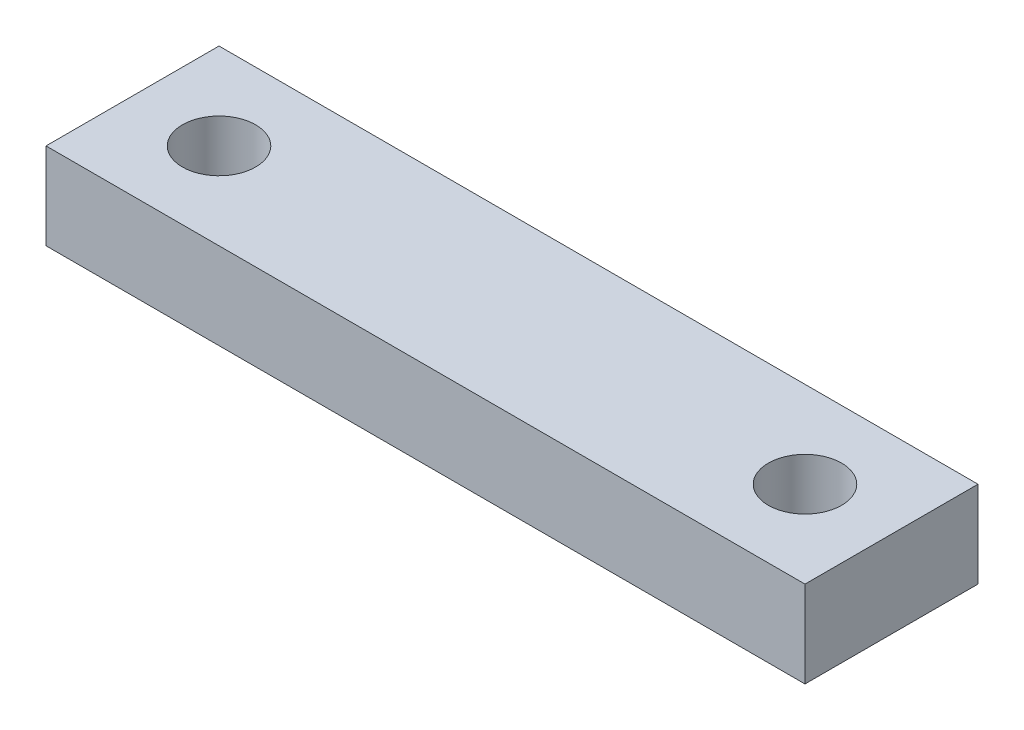
ISO-10303-21;
HEADER;
FILE_DESCRIPTION(('STEP AP214'),'2;1');
FILE_NAME('part.step','',(''),(''),'','','');
FILE_SCHEMA(('AUTOMOTIVE_DESIGN { 1 0 10303 214 1 1 1 1 }'));
ENDSEC;
DATA;
#1=APPLICATION_CONTEXT('core data for automotive mechanical design processes');
#2=APPLICATION_PROTOCOL_DEFINITION('international standard','automotive_design',2000,#1);
#3=PRODUCT_CONTEXT('',#1,'mechanical');
#4=PRODUCT('Part','Part','',(#3));
#5=PRODUCT_RELATED_PRODUCT_CATEGORY('part','',(#4));
#6=PRODUCT_DEFINITION_FORMATION('','',#4);
#7=PRODUCT_DEFINITION_CONTEXT('part definition',#1,'design');
#8=PRODUCT_DEFINITION('design','',#6,#7);
#9=PRODUCT_DEFINITION_SHAPE('','',#8);
#10=(LENGTH_UNIT() NAMED_UNIT(*) SI_UNIT(.MILLI.,.METRE.));
#11=(NAMED_UNIT(*) PLANE_ANGLE_UNIT() SI_UNIT($,.RADIAN.));
#12=(NAMED_UNIT(*) SI_UNIT($,.STERADIAN.) SOLID_ANGLE_UNIT());
#13=UNCERTAINTY_MEASURE_WITH_UNIT(LENGTH_MEASURE(1.E-05),#10,'distance_accuracy_value','');
#14=(GEOMETRIC_REPRESENTATION_CONTEXT(3) GLOBAL_UNCERTAINTY_ASSIGNED_CONTEXT((#13)) GLOBAL_UNIT_ASSIGNED_CONTEXT((#10,
#11,#12)) REPRESENTATION_CONTEXT('',''));
#15=CARTESIAN_POINT('',(0.,0.,0.));
#16=DIRECTION('',(0.,0.,1.));
#17=DIRECTION('',(1.,0.,0.));
#18=AXIS2_PLACEMENT_3D('',#15,#16,#17);
#19=CARTESIAN_POINT('',(-215.213432633717,20.1411509817197,60.));
#20=DIRECTION('',(1.,0.,0.));
#21=DIRECTION('',(0.,0.,-1.));
#22=AXIS2_PLACEMENT_3D('',#19,#20,#21);
#23=PLANE('',#22);
#24=DIRECTION('',(0.,-1.,0.));
#25=VECTOR('',#24,1.);
#26=CARTESIAN_POINT('',(-215.213432633717,20.1411509817197,0.));
#27=LINE('',#26,#25);
#28=CARTESIAN_POINT('',(-215.213432633717,20.1411509817197,0.));
#29=VERTEX_POINT('',#28);
#30=CARTESIAN_POINT('',(-215.213432633717,-9.8588490182803,0.));
#31=VERTEX_POINT('',#30);
#32=EDGE_CURVE('E113',#29,#31,#27,.T.);
#33=ORIENTED_EDGE('',*,*,#32,.T.);
#34=DIRECTION('',(0.,0.,-1.));
#35=VECTOR('',#34,1.);
#36=CARTESIAN_POINT('',(-215.213432633717,-9.8588490182803,60.));
#37=LINE('',#36,#35);
#38=CARTESIAN_POINT('',(-215.213432633717,-9.8588490182803,60.));
#39=VERTEX_POINT('',#38);
#40=EDGE_CURVE('E11',#39,#31,#37,.T.);
#41=ORIENTED_EDGE('',*,*,#40,.F.);
#42=DIRECTION('',(0.,-1.,0.));
#43=VECTOR('',#42,1.);
#44=CARTESIAN_POINT('',(-215.213432633717,20.1411509817197,60.));
#45=LINE('',#44,#43);
#46=CARTESIAN_POINT('',(-215.213432633717,20.1411509817197,60.));
#47=VERTEX_POINT('',#46);
#48=EDGE_CURVE('E97',#47,#39,#45,.T.);
#49=ORIENTED_EDGE('',*,*,#48,.F.);
#50=DIRECTION('',(0.,0.,-1.));
#51=VECTOR('',#50,1.);
#52=CARTESIAN_POINT('',(-215.213432633717,20.1411509817197,60.));
#53=LINE('',#52,#51);
#54=EDGE_CURVE('E112',#47,#29,#53,.T.);
#55=ORIENTED_EDGE('',*,*,#54,.T.);
#56=EDGE_LOOP('',(#33,#41,#49,#55));
#57=FACE_BOUND('',#56,.T.);
#58=ADVANCED_FACE('F50',(#57),#23,.F.);
#59=CARTESIAN_POINT('',(-215.213432633717,-9.8588490182803,60.));
#60=DIRECTION('',(0.,1.,0.));
#61=DIRECTION('',(0.,0.,1.));
#62=AXIS2_PLACEMENT_3D('',#59,#60,#61);
#63=PLANE('',#62);
#64=CARTESIAN_POINT('',(17.986567366283,-9.8588490182803,30.));
#65=DIRECTION('',(0.,1.,0.));
#66=DIRECTION('',(0.,0.,1.));
#67=AXIS2_PLACEMENT_3D('',#64,#65,#66);
#68=CIRCLE('',#67,12.7);
#69=CARTESIAN_POINT('',(17.986567366283,-9.8588490182803,42.7));
#70=VERTEX_POINT('',#69);
#71=EDGE_CURVE('E118',#70,#70,#68,.T.);
#72=ORIENTED_EDGE('',*,*,#71,.T.);
#73=EDGE_LOOP('',(#72));
#74=FACE_BOUND('',#73,.T.);
#75=CARTESIAN_POINT('',(-185.213432633717,-9.8588490182803,30.));
#76=DIRECTION('',(0.,1.,0.));
#77=DIRECTION('',(0.,0.,1.));
#78=AXIS2_PLACEMENT_3D('',#75,#76,#77);
#79=CIRCLE('',#78,12.7);
#80=CARTESIAN_POINT('',(-185.213432633717,-9.8588490182803,42.7));
#81=VERTEX_POINT('',#80);
#82=EDGE_CURVE('E138',#81,#81,#79,.T.);
#83=ORIENTED_EDGE('',*,*,#82,.T.);
#84=EDGE_LOOP('',(#83));
#85=FACE_BOUND('',#84,.T.);
#86=DIRECTION('',(1.,0.,0.));
#87=VECTOR('',#86,1.);
#88=CARTESIAN_POINT('',(-215.213432633717,-9.8588490182803,0.));
#89=LINE('',#88,#87);
#90=CARTESIAN_POINT('',(47.986567366283,-9.8588490182803,0.));
#91=VERTEX_POINT('',#90);
#92=EDGE_CURVE('E102',#31,#91,#89,.T.);
#93=ORIENTED_EDGE('',*,*,#92,.T.);
#94=DIRECTION('',(0.,0.,-1.));
#95=VECTOR('',#94,1.);
#96=CARTESIAN_POINT('',(47.986567366283,-9.8588490182803,60.));
#97=LINE('',#96,#95);
#98=CARTESIAN_POINT('',(47.986567366283,-9.8588490182803,60.));
#99=VERTEX_POINT('',#98);
#100=EDGE_CURVE('E57',#99,#91,#97,.T.);
#101=ORIENTED_EDGE('',*,*,#100,.F.);
#102=DIRECTION('',(1.,0.,0.));
#103=VECTOR('',#102,1.);
#104=CARTESIAN_POINT('',(-215.213432633717,-9.8588490182803,60.));
#105=LINE('',#104,#103);
#106=EDGE_CURVE('E94',#39,#99,#105,.T.);
#107=ORIENTED_EDGE('',*,*,#106,.F.);
#108=ORIENTED_EDGE('',*,*,#40,.T.);
#109=EDGE_LOOP('',(#93,#101,#107,#108));
#110=FACE_BOUND('',#109,.T.);
#111=ADVANCED_FACE('F103',(#74,#85,#110),#63,.F.);
#112=CARTESIAN_POINT('',(47.986567366283,20.1411509817197,60.));
#113=DIRECTION('',(-1.,0.,0.));
#114=DIRECTION('',(0.,-1.,0.));
#115=AXIS2_PLACEMENT_3D('',#112,#113,#114);
#116=PLANE('',#115);
#117=DIRECTION('',(0.,1.,0.));
#118=VECTOR('',#117,1.);
#119=CARTESIAN_POINT('',(47.986567366283,20.1411509817197,0.));
#120=LINE('',#119,#118);
#121=CARTESIAN_POINT('',(47.986567366283,20.1411509817197,0.));
#122=VERTEX_POINT('',#121);
#123=EDGE_CURVE('E83',#91,#122,#120,.T.);
#124=ORIENTED_EDGE('',*,*,#123,.T.);
#125=DIRECTION('',(0.,0.,-1.));
#126=VECTOR('',#125,1.);
#127=CARTESIAN_POINT('',(47.986567366283,20.1411509817197,60.));
#128=LINE('',#127,#126);
#129=CARTESIAN_POINT('',(47.986567366283,20.1411509817197,60.));
#130=VERTEX_POINT('',#129);
#131=EDGE_CURVE('E106',#130,#122,#128,.T.);
#132=ORIENTED_EDGE('',*,*,#131,.F.);
#133=DIRECTION('',(0.,1.,0.));
#134=VECTOR('',#133,1.);
#135=CARTESIAN_POINT('',(47.986567366283,20.1411509817197,60.));
#136=LINE('',#135,#134);
#137=EDGE_CURVE('E100',#99,#130,#136,.T.);
#138=ORIENTED_EDGE('',*,*,#137,.F.);
#139=ORIENTED_EDGE('',*,*,#100,.T.);
#140=EDGE_LOOP('',(#124,#132,#138,#139));
#141=FACE_BOUND('',#140,.T.);
#142=ADVANCED_FACE('F110',(#141),#116,.F.);
#143=CARTESIAN_POINT('',(-215.213432633717,20.1411509817197,60.));
#144=DIRECTION('',(0.,-1.,0.));
#145=DIRECTION('',(0.,0.,-1.));
#146=AXIS2_PLACEMENT_3D('',#143,#144,#145);
#147=PLANE('',#146);
#148=CARTESIAN_POINT('',(17.986567366283,20.1411509817197,30.));
#149=DIRECTION('',(0.,1.,0.));
#150=DIRECTION('',(0.,0.,1.));
#151=AXIS2_PLACEMENT_3D('',#148,#149,#150);
#152=CIRCLE('',#151,12.7);
#153=CARTESIAN_POINT('',(17.986567366283,20.1411509817197,42.7));
#154=VERTEX_POINT('',#153);
#155=EDGE_CURVE('E145',#154,#154,#152,.T.);
#156=ORIENTED_EDGE('',*,*,#155,.F.);
#157=EDGE_LOOP('',(#156));
#158=FACE_BOUND('',#157,.T.);
#159=CARTESIAN_POINT('',(-185.213432633717,20.1411509817197,30.));
#160=DIRECTION('',(0.,1.,0.));
#161=DIRECTION('',(0.,0.,1.));
#162=AXIS2_PLACEMENT_3D('',#159,#160,#161);
#163=CIRCLE('',#162,12.7);
#164=CARTESIAN_POINT('',(-185.213432633717,20.1411509817197,42.7));
#165=VERTEX_POINT('',#164);
#166=EDGE_CURVE('E137',#165,#165,#163,.T.);
#167=ORIENTED_EDGE('',*,*,#166,.F.);
#168=EDGE_LOOP('',(#167));
#169=FACE_BOUND('',#168,.T.);
#170=DIRECTION('',(-1.,0.,0.));
#171=VECTOR('',#170,1.);
#172=CARTESIAN_POINT('',(-215.213432633717,20.1411509817197,0.));
#173=LINE('',#172,#171);
#174=EDGE_CURVE('E87',#122,#29,#173,.T.);
#175=ORIENTED_EDGE('',*,*,#174,.T.);
#176=ORIENTED_EDGE('',*,*,#54,.F.);
#177=DIRECTION('',(-1.,0.,0.));
#178=VECTOR('',#177,1.);
#179=CARTESIAN_POINT('',(-215.213432633717,20.1411509817197,60.));
#180=LINE('',#179,#178);
#181=EDGE_CURVE('E63',#130,#47,#180,.T.);
#182=ORIENTED_EDGE('',*,*,#181,.F.);
#183=ORIENTED_EDGE('',*,*,#131,.T.);
#184=EDGE_LOOP('',(#175,#176,#182,#183));
#185=FACE_BOUND('',#184,.T.);
#186=ADVANCED_FACE('F129',(#158,#169,#185),#147,.F.);
#187=CARTESIAN_POINT('',(0.,0.,60.));
#188=DIRECTION('',(0.,0.,1.));
#189=DIRECTION('',(1.,0.,0.));
#190=AXIS2_PLACEMENT_3D('',#187,#188,#189);
#191=PLANE('',#190);
#192=ORIENTED_EDGE('',*,*,#48,.T.);
#193=ORIENTED_EDGE('',*,*,#106,.T.);
#194=ORIENTED_EDGE('',*,*,#137,.T.);
#195=ORIENTED_EDGE('',*,*,#181,.T.);
#196=EDGE_LOOP('',(#192,#193,#194,#195));
#197=FACE_BOUND('',#196,.T.);
#198=ADVANCED_FACE('F92',(#197),#191,.T.);
#199=CARTESIAN_POINT('',(0.,0.,0.));
#200=DIRECTION('',(0.,0.,1.));
#201=DIRECTION('',(1.,0.,0.));
#202=AXIS2_PLACEMENT_3D('',#199,#200,#201);
#203=PLANE('',#202);
#204=ORIENTED_EDGE('',*,*,#32,.F.);
#205=ORIENTED_EDGE('',*,*,#174,.F.);
#206=ORIENTED_EDGE('',*,*,#123,.F.);
#207=ORIENTED_EDGE('',*,*,#92,.F.);
#208=EDGE_LOOP('',(#204,#205,#206,#207));
#209=FACE_BOUND('',#208,.T.);
#210=ADVANCED_FACE('F131',(#209),#203,.F.);
#211=CARTESIAN_POINT('',(-185.213432633717,-9.8588490182803,30.));
#212=DIRECTION('',(0.,1.,0.));
#213=DIRECTION('',(0.,0.,1.));
#214=AXIS2_PLACEMENT_3D('',#211,#212,#213);
#215=CYLINDRICAL_SURFACE('',#214,12.7);
#216=ORIENTED_EDGE('',*,*,#82,.F.);
#217=EDGE_LOOP('',(#216));
#218=FACE_BOUND('',#217,.T.);
#219=ORIENTED_EDGE('',*,*,#166,.T.);
#220=EDGE_LOOP('',(#219));
#221=FACE_BOUND('',#220,.T.);
#222=ADVANCED_FACE('F160',(#218,#221),#215,.F.);
#223=CARTESIAN_POINT('',(17.986567366283,-9.8588490182803,30.));
#224=DIRECTION('',(0.,1.,0.));
#225=DIRECTION('',(0.,0.,1.));
#226=AXIS2_PLACEMENT_3D('',#223,#224,#225);
#227=CYLINDRICAL_SURFACE('',#226,12.7);
#228=ORIENTED_EDGE('',*,*,#71,.F.);
#229=EDGE_LOOP('',(#228));
#230=FACE_BOUND('',#229,.T.);
#231=ORIENTED_EDGE('',*,*,#155,.T.);
#232=EDGE_LOOP('',(#231));
#233=FACE_BOUND('',#232,.T.);
#234=ADVANCED_FACE('F152',(#230,#233),#227,.F.);
#235=CLOSED_SHELL('',(#58,#111,#142,#186,#198,#210,#222,#234));
#236=MANIFOLD_SOLID_BREP('B2',#235);
#237=ADVANCED_BREP_SHAPE_REPRESENTATION('',(#18,#236),#14);
#238=SHAPE_DEFINITION_REPRESENTATION(#9,#237);
ENDSEC;
END-ISO-10303-21;
